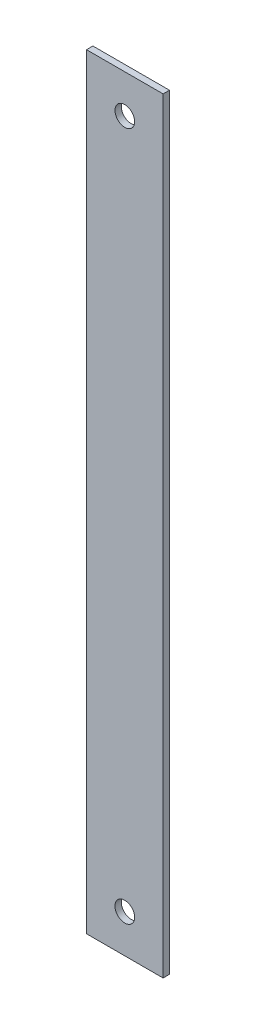
ISO-10303-21;
HEADER;
FILE_DESCRIPTION(('STEP AP214'),'2;1');
FILE_NAME('part.step','',(''),(''),'','','');
FILE_SCHEMA(('AUTOMOTIVE_DESIGN { 1 0 10303 214 1 1 1 1 }'));
ENDSEC;
DATA;
#1=APPLICATION_CONTEXT('core data for automotive mechanical design processes');
#2=APPLICATION_PROTOCOL_DEFINITION('international standard','automotive_design',2000,#1);
#3=PRODUCT_CONTEXT('',#1,'mechanical');
#4=PRODUCT('Part','Part','',(#3));
#5=PRODUCT_RELATED_PRODUCT_CATEGORY('part','',(#4));
#6=PRODUCT_DEFINITION_FORMATION('','',#4);
#7=PRODUCT_DEFINITION_CONTEXT('part definition',#1,'design');
#8=PRODUCT_DEFINITION('design','',#6,#7);
#9=PRODUCT_DEFINITION_SHAPE('','',#8);
#10=(LENGTH_UNIT() NAMED_UNIT(*) SI_UNIT(.MILLI.,.METRE.));
#11=(NAMED_UNIT(*) PLANE_ANGLE_UNIT() SI_UNIT($,.RADIAN.));
#12=(NAMED_UNIT(*) SI_UNIT($,.STERADIAN.) SOLID_ANGLE_UNIT());
#13=UNCERTAINTY_MEASURE_WITH_UNIT(LENGTH_MEASURE(1.E-05),#10,'distance_accuracy_value','');
#14=(GEOMETRIC_REPRESENTATION_CONTEXT(3) GLOBAL_UNCERTAINTY_ASSIGNED_CONTEXT((#13)) GLOBAL_UNIT_ASSIGNED_CONTEXT((#10,
#11,#12)) REPRESENTATION_CONTEXT('',''));
#15=CARTESIAN_POINT('',(0.,0.,0.));
#16=DIRECTION('',(0.,0.,1.));
#17=DIRECTION('',(1.,0.,0.));
#18=AXIS2_PLACEMENT_3D('',#15,#16,#17);
#19=CARTESIAN_POINT('',(0.,0.,0.));
#20=DIRECTION('',(0.,0.,-1.));
#21=DIRECTION('',(-1.,0.,0.));
#22=AXIS2_PLACEMENT_3D('',#19,#20,#21);
#23=PLANE('',#22);
#24=DIRECTION('',(0.,-1.,0.));
#25=VECTOR('',#24,1.);
#26=CARTESIAN_POINT('',(0.,0.,0.));
#27=LINE('',#26,#25);
#28=CARTESIAN_POINT('',(0.,381.,0.));
#29=VERTEX_POINT('',#28);
#30=CARTESIAN_POINT('',(0.,0.,0.));
#31=VERTEX_POINT('',#30);
#32=EDGE_CURVE('E97',#29,#31,#27,.T.);
#33=ORIENTED_EDGE('',*,*,#32,.F.);
#34=DIRECTION('',(-1.,0.,0.));
#35=VECTOR('',#34,1.);
#36=CARTESIAN_POINT('',(0.,381.,0.));
#37=LINE('',#36,#35);
#38=CARTESIAN_POINT('',(38.1,381.,0.));
#39=VERTEX_POINT('',#38);
#40=EDGE_CURVE('E73',#39,#29,#37,.T.);
#41=ORIENTED_EDGE('',*,*,#40,.F.);
#42=DIRECTION('',(0.,1.,0.));
#43=VECTOR('',#42,1.);
#44=CARTESIAN_POINT('',(38.1,0.,0.));
#45=LINE('',#44,#43);
#46=CARTESIAN_POINT('',(38.1,0.,0.));
#47=VERTEX_POINT('',#46);
#48=EDGE_CURVE('E67',#47,#39,#45,.T.);
#49=ORIENTED_EDGE('',*,*,#48,.F.);
#50=DIRECTION('',(1.,0.,0.));
#51=VECTOR('',#50,1.);
#52=CARTESIAN_POINT('',(0.,0.,0.));
#53=LINE('',#52,#51);
#54=EDGE_CURVE('E89',#31,#47,#53,.T.);
#55=ORIENTED_EDGE('',*,*,#54,.F.);
#56=EDGE_LOOP('',(#33,#41,#49,#55));
#57=FACE_BOUND('',#56,.T.);
#58=CARTESIAN_POINT('',(19.05,19.05,0.));
#59=DIRECTION('',(0.,0.,1.));
#60=DIRECTION('',(1.,0.,0.));
#61=AXIS2_PLACEMENT_3D('',#58,#59,#60);
#62=CIRCLE('',#61,4.90219999999996);
#63=CARTESIAN_POINT('',(23.9522,19.05,0.));
#64=VERTEX_POINT('',#63);
#65=EDGE_CURVE('E100',#64,#64,#62,.T.);
#66=ORIENTED_EDGE('',*,*,#65,.T.);
#67=EDGE_LOOP('',(#66));
#68=FACE_BOUND('',#67,.T.);
#69=CARTESIAN_POINT('',(19.05,361.95,0.));
#70=DIRECTION('',(0.,0.,1.));
#71=DIRECTION('',(1.,0.,0.));
#72=AXIS2_PLACEMENT_3D('',#69,#70,#71);
#73=CIRCLE('',#72,4.90219999999997);
#74=CARTESIAN_POINT('',(23.9522,361.95,0.));
#75=VERTEX_POINT('',#74);
#76=EDGE_CURVE('E116',#75,#75,#73,.T.);
#77=ORIENTED_EDGE('',*,*,#76,.T.);
#78=EDGE_LOOP('',(#77));
#79=FACE_BOUND('',#78,.T.);
#80=ADVANCED_FACE('F33',(#57,#68,#79),#23,.T.);
#81=CARTESIAN_POINT('',(0.,0.,3.175));
#82=DIRECTION('',(1.,0.,0.));
#83=DIRECTION('',(0.,0.,-1.));
#84=AXIS2_PLACEMENT_3D('',#81,#82,#83);
#85=PLANE('',#84);
#86=ORIENTED_EDGE('',*,*,#32,.T.);
#87=DIRECTION('',(0.,0.,-1.));
#88=VECTOR('',#87,1.);
#89=CARTESIAN_POINT('',(0.,0.,3.175));
#90=LINE('',#89,#88);
#91=CARTESIAN_POINT('',(0.,0.,3.175));
#92=VERTEX_POINT('',#91);
#93=EDGE_CURVE('E11',#92,#31,#90,.T.);
#94=ORIENTED_EDGE('',*,*,#93,.F.);
#95=DIRECTION('',(0.,-1.,0.));
#96=VECTOR('',#95,1.);
#97=CARTESIAN_POINT('',(0.,0.,3.175));
#98=LINE('',#97,#96);
#99=CARTESIAN_POINT('',(0.,381.,3.175));
#100=VERTEX_POINT('',#99);
#101=EDGE_CURVE('E85',#100,#92,#98,.T.);
#102=ORIENTED_EDGE('',*,*,#101,.F.);
#103=DIRECTION('',(0.,0.,-1.));
#104=VECTOR('',#103,1.);
#105=CARTESIAN_POINT('',(0.,381.,3.175));
#106=LINE('',#105,#104);
#107=EDGE_CURVE('E93',#100,#29,#106,.T.);
#108=ORIENTED_EDGE('',*,*,#107,.T.);
#109=EDGE_LOOP('',(#86,#94,#102,#108));
#110=FACE_BOUND('',#109,.T.);
#111=ADVANCED_FACE('F35',(#110),#85,.F.);
#112=CARTESIAN_POINT('',(0.,0.,3.175));
#113=DIRECTION('',(0.,1.,0.));
#114=DIRECTION('',(0.,0.,1.));
#115=AXIS2_PLACEMENT_3D('',#112,#113,#114);
#116=PLANE('',#115);
#117=ORIENTED_EDGE('',*,*,#54,.T.);
#118=DIRECTION('',(0.,0.,-1.));
#119=VECTOR('',#118,1.);
#120=CARTESIAN_POINT('',(38.1,0.,3.175));
#121=LINE('',#120,#119);
#122=CARTESIAN_POINT('',(38.1,0.,3.175));
#123=VERTEX_POINT('',#122);
#124=EDGE_CURVE('E42',#123,#47,#121,.T.);
#125=ORIENTED_EDGE('',*,*,#124,.F.);
#126=DIRECTION('',(1.,0.,0.));
#127=VECTOR('',#126,1.);
#128=CARTESIAN_POINT('',(0.,0.,3.175));
#129=LINE('',#128,#127);
#130=EDGE_CURVE('E80',#92,#123,#129,.T.);
#131=ORIENTED_EDGE('',*,*,#130,.F.);
#132=ORIENTED_EDGE('',*,*,#93,.T.);
#133=EDGE_LOOP('',(#117,#125,#131,#132));
#134=FACE_BOUND('',#133,.T.);
#135=ADVANCED_FACE('F88',(#134),#116,.F.);
#136=CARTESIAN_POINT('',(38.1,0.,3.175));
#137=DIRECTION('',(-1.,0.,0.));
#138=DIRECTION('',(0.,0.,1.));
#139=AXIS2_PLACEMENT_3D('',#136,#137,#138);
#140=PLANE('',#139);
#141=ORIENTED_EDGE('',*,*,#48,.T.);
#142=DIRECTION('',(0.,0.,-1.));
#143=VECTOR('',#142,1.);
#144=CARTESIAN_POINT('',(38.1,381.,3.175));
#145=LINE('',#144,#143);
#146=CARTESIAN_POINT('',(38.1,381.,3.175));
#147=VERTEX_POINT('',#146);
#148=EDGE_CURVE('E90',#147,#39,#145,.T.);
#149=ORIENTED_EDGE('',*,*,#148,.F.);
#150=DIRECTION('',(0.,1.,0.));
#151=VECTOR('',#150,1.);
#152=CARTESIAN_POINT('',(38.1,0.,3.175));
#153=LINE('',#152,#151);
#154=EDGE_CURVE('E83',#123,#147,#153,.T.);
#155=ORIENTED_EDGE('',*,*,#154,.F.);
#156=ORIENTED_EDGE('',*,*,#124,.T.);
#157=EDGE_LOOP('',(#141,#149,#155,#156));
#158=FACE_BOUND('',#157,.T.);
#159=ADVANCED_FACE('F91',(#158),#140,.F.);
#160=CARTESIAN_POINT('',(0.,381.,3.175));
#161=DIRECTION('',(0.,-1.,0.));
#162=DIRECTION('',(0.,0.,-1.));
#163=AXIS2_PLACEMENT_3D('',#160,#161,#162);
#164=PLANE('',#163);
#165=ORIENTED_EDGE('',*,*,#40,.T.);
#166=ORIENTED_EDGE('',*,*,#107,.F.);
#167=DIRECTION('',(-1.,0.,0.));
#168=VECTOR('',#167,1.);
#169=CARTESIAN_POINT('',(0.,381.,3.175));
#170=LINE('',#169,#168);
#171=EDGE_CURVE('E50',#147,#100,#170,.T.);
#172=ORIENTED_EDGE('',*,*,#171,.F.);
#173=ORIENTED_EDGE('',*,*,#148,.T.);
#174=EDGE_LOOP('',(#165,#166,#172,#173));
#175=FACE_BOUND('',#174,.T.);
#176=ADVANCED_FACE('F105',(#175),#164,.F.);
#177=CARTESIAN_POINT('',(0.,0.,3.175));
#178=DIRECTION('',(0.,0.,-1.));
#179=DIRECTION('',(-1.,0.,0.));
#180=AXIS2_PLACEMENT_3D('',#177,#178,#179);
#181=PLANE('',#180);
#182=CARTESIAN_POINT('',(19.05,361.95,3.175));
#183=DIRECTION('',(0.,0.,1.));
#184=DIRECTION('',(1.,0.,0.));
#185=AXIS2_PLACEMENT_3D('',#182,#183,#184);
#186=CIRCLE('',#185,4.9022);
#187=CARTESIAN_POINT('',(23.9522,361.95,3.175));
#188=VERTEX_POINT('',#187);
#189=EDGE_CURVE('E119',#188,#188,#186,.T.);
#190=ORIENTED_EDGE('',*,*,#189,.F.);
#191=EDGE_LOOP('',(#190));
#192=FACE_BOUND('',#191,.T.);
#193=CARTESIAN_POINT('',(19.05,19.05,3.175));
#194=DIRECTION('',(0.,0.,1.));
#195=DIRECTION('',(1.,0.,0.));
#196=AXIS2_PLACEMENT_3D('',#193,#194,#195);
#197=CIRCLE('',#196,4.9022);
#198=CARTESIAN_POINT('',(23.9522,19.05,3.175));
#199=VERTEX_POINT('',#198);
#200=EDGE_CURVE('E113',#199,#199,#197,.T.);
#201=ORIENTED_EDGE('',*,*,#200,.F.);
#202=EDGE_LOOP('',(#201));
#203=FACE_BOUND('',#202,.T.);
#204=ORIENTED_EDGE('',*,*,#101,.T.);
#205=ORIENTED_EDGE('',*,*,#130,.T.);
#206=ORIENTED_EDGE('',*,*,#154,.T.);
#207=ORIENTED_EDGE('',*,*,#171,.T.);
#208=EDGE_LOOP('',(#204,#205,#206,#207));
#209=FACE_BOUND('',#208,.T.);
#210=ADVANCED_FACE('F81',(#192,#203,#209),#181,.F.);
#211=CARTESIAN_POINT('',(19.05,19.05,3.175));
#212=DIRECTION('',(0.,0.,1.));
#213=DIRECTION('',(1.,0.,0.));
#214=AXIS2_PLACEMENT_3D('',#211,#212,#213);
#215=CYLINDRICAL_SURFACE('',#214,4.90219999999998);
#216=ORIENTED_EDGE('',*,*,#65,.F.);
#217=EDGE_LOOP('',(#216));
#218=FACE_BOUND('',#217,.T.);
#219=ORIENTED_EDGE('',*,*,#200,.T.);
#220=EDGE_LOOP('',(#219));
#221=FACE_BOUND('',#220,.T.);
#222=ADVANCED_FACE('F127',(#218,#221),#215,.F.);
#223=CARTESIAN_POINT('',(19.05,361.95,3.175));
#224=DIRECTION('',(0.,0.,1.));
#225=DIRECTION('',(1.,0.,0.));
#226=AXIS2_PLACEMENT_3D('',#223,#224,#225);
#227=CYLINDRICAL_SURFACE('',#226,4.90219999999998);
#228=ORIENTED_EDGE('',*,*,#76,.F.);
#229=EDGE_LOOP('',(#228));
#230=FACE_BOUND('',#229,.T.);
#231=ORIENTED_EDGE('',*,*,#189,.T.);
#232=EDGE_LOOP('',(#231));
#233=FACE_BOUND('',#232,.T.);
#234=ADVANCED_FACE('F123',(#230,#233),#227,.F.);
#235=CLOSED_SHELL('',(#80,#111,#135,#159,#176,#210,#222,#234));
#236=MANIFOLD_SOLID_BREP('B2',#235);
#237=ADVANCED_BREP_SHAPE_REPRESENTATION('',(#18,#236),#14);
#238=SHAPE_DEFINITION_REPRESENTATION(#9,#237);
ENDSEC;
END-ISO-10303-21;
